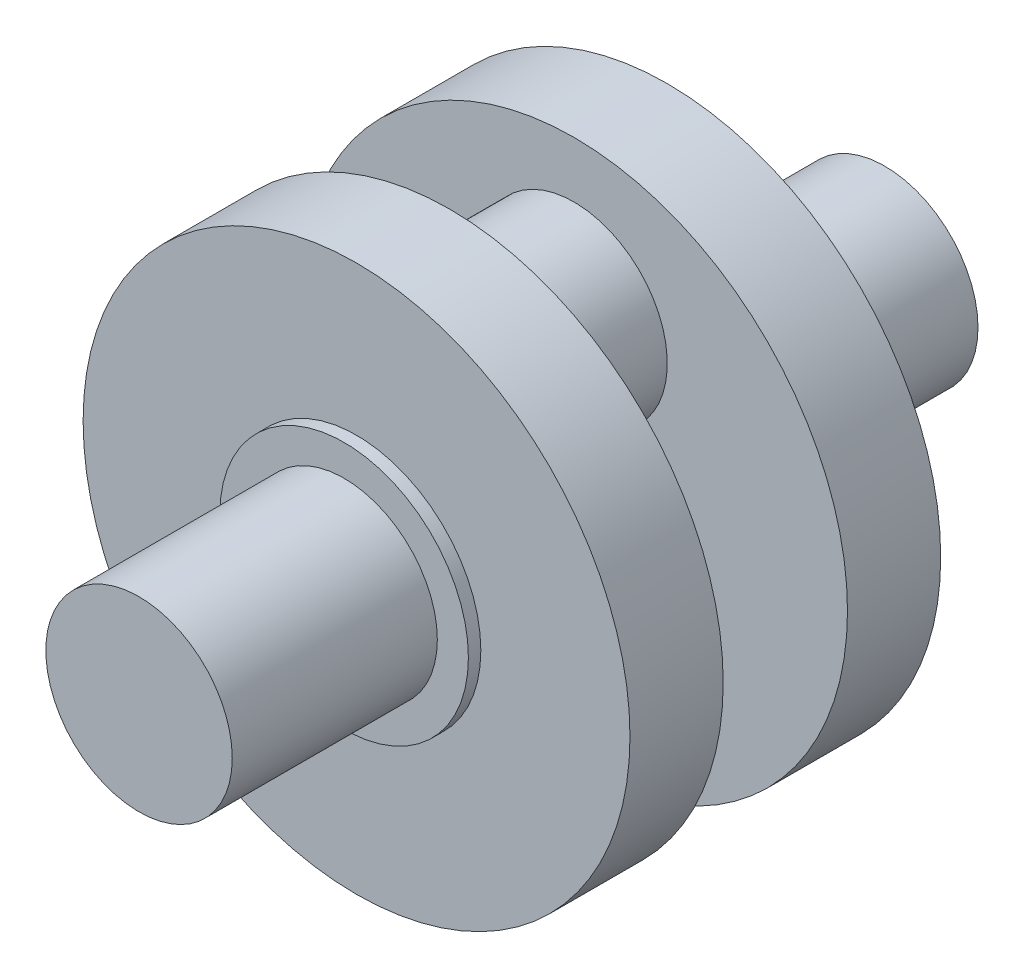
ISO-10303-21;
HEADER;
FILE_DESCRIPTION(('STEP AP214'),'2;1');
FILE_NAME('part.step','',(''),(''),'','','');
FILE_SCHEMA(('AUTOMOTIVE_DESIGN { 1 0 10303 214 1 1 1 1 }'));
ENDSEC;
DATA;
#1=APPLICATION_CONTEXT('core data for automotive mechanical design processes');
#2=APPLICATION_PROTOCOL_DEFINITION('international standard','automotive_design',2000,#1);
#3=PRODUCT_CONTEXT('',#1,'mechanical');
#4=PRODUCT('Part','Part','',(#3));
#5=PRODUCT_RELATED_PRODUCT_CATEGORY('part','',(#4));
#6=PRODUCT_DEFINITION_FORMATION('','',#4);
#7=PRODUCT_DEFINITION_CONTEXT('part definition',#1,'design');
#8=PRODUCT_DEFINITION('design','',#6,#7);
#9=PRODUCT_DEFINITION_SHAPE('','',#8);
#10=(LENGTH_UNIT() NAMED_UNIT(*) SI_UNIT(.MILLI.,.METRE.));
#11=(NAMED_UNIT(*) PLANE_ANGLE_UNIT() SI_UNIT($,.RADIAN.));
#12=(NAMED_UNIT(*) SI_UNIT($,.STERADIAN.) SOLID_ANGLE_UNIT());
#13=UNCERTAINTY_MEASURE_WITH_UNIT(LENGTH_MEASURE(1.E-05),#10,'distance_accuracy_value','');
#14=(GEOMETRIC_REPRESENTATION_CONTEXT(3) GLOBAL_UNCERTAINTY_ASSIGNED_CONTEXT((#13)) GLOBAL_UNIT_ASSIGNED_CONTEXT((#10,
#11,#12)) REPRESENTATION_CONTEXT('',''));
#15=CARTESIAN_POINT('',(0.,0.,0.));
#16=DIRECTION('',(0.,0.,1.));
#17=DIRECTION('',(1.,0.,0.));
#18=AXIS2_PLACEMENT_3D('',#15,#16,#17);
#19=CARTESIAN_POINT('',(0.,0.,33.));
#20=DIRECTION('',(0.,0.,-1.));
#21=DIRECTION('',(-1.,0.,0.));
#22=AXIS2_PLACEMENT_3D('',#19,#20,#21);
#23=CYLINDRICAL_SURFACE('',#22,15.);
#24=CARTESIAN_POINT('',(0.,0.,33.));
#25=DIRECTION('',(0.,0.,1.));
#26=DIRECTION('',(1.,0.,0.));
#27=AXIS2_PLACEMENT_3D('',#24,#25,#26);
#28=CIRCLE('',#27,15.);
#29=CARTESIAN_POINT('',(15.,0.,33.));
#30=VERTEX_POINT('',#29);
#31=EDGE_CURVE('E10',#30,#30,#28,.T.);
#32=ORIENTED_EDGE('',*,*,#31,.F.);
#33=EDGE_LOOP('',(#32));
#34=FACE_BOUND('',#33,.T.);
#35=CARTESIAN_POINT('',(0.,0.,0.));
#36=DIRECTION('',(0.,0.,1.));
#37=DIRECTION('',(1.,0.,0.));
#38=AXIS2_PLACEMENT_3D('',#35,#36,#37);
#39=CIRCLE('',#38,15.);
#40=CARTESIAN_POINT('',(15.,0.,0.));
#41=VERTEX_POINT('',#40);
#42=EDGE_CURVE('E44',#41,#41,#39,.T.);
#43=ORIENTED_EDGE('',*,*,#42,.T.);
#44=EDGE_LOOP('',(#43));
#45=FACE_BOUND('',#44,.T.);
#46=ADVANCED_FACE('F41',(#34,#45),#23,.T.);
#47=CARTESIAN_POINT('',(0.,0.,33.));
#48=DIRECTION('',(0.,0.,1.));
#49=DIRECTION('',(1.,0.,0.));
#50=AXIS2_PLACEMENT_3D('',#47,#48,#49);
#51=PLANE('',#50);
#52=ORIENTED_EDGE('',*,*,#31,.T.);
#53=EDGE_LOOP('',(#52));
#54=FACE_BOUND('',#53,.T.);
#55=ADVANCED_FACE('F124',(#54),#51,.T.);
#56=CARTESIAN_POINT('',(0.,0.,-2.));
#57=DIRECTION('',(0.,0.,1.));
#58=DIRECTION('',(1.,0.,0.));
#59=AXIS2_PLACEMENT_3D('',#56,#57,#58);
#60=CYLINDRICAL_SURFACE('',#59,20.);
#61=CARTESIAN_POINT('',(0.,0.,-2.));
#62=DIRECTION('',(0.,0.,-1.));
#63=DIRECTION('',(-1.,0.,0.));
#64=AXIS2_PLACEMENT_3D('',#61,#62,#63);
#65=CIRCLE('',#64,20.);
#66=CARTESIAN_POINT('',(-20.,0.,-2.));
#67=VERTEX_POINT('',#66);
#68=EDGE_CURVE('E53',#67,#67,#65,.T.);
#69=ORIENTED_EDGE('',*,*,#68,.F.);
#70=EDGE_LOOP('',(#69));
#71=FACE_BOUND('',#70,.T.);
#72=CARTESIAN_POINT('',(0.,0.,0.));
#73=DIRECTION('',(0.,0.,-1.));
#74=DIRECTION('',(-1.,0.,0.));
#75=AXIS2_PLACEMENT_3D('',#72,#73,#74);
#76=CIRCLE('',#75,20.);
#77=CARTESIAN_POINT('',(-20.,0.,0.));
#78=VERTEX_POINT('',#77);
#79=EDGE_CURVE('E55',#78,#78,#76,.T.);
#80=ORIENTED_EDGE('',*,*,#79,.T.);
#81=EDGE_LOOP('',(#80));
#82=FACE_BOUND('',#81,.T.);
#83=ADVANCED_FACE('F129',(#71,#82),#60,.T.);
#84=CARTESIAN_POINT('',(0.,0.,0.));
#85=DIRECTION('',(0.,0.,-1.));
#86=DIRECTION('',(-1.,0.,0.));
#87=AXIS2_PLACEMENT_3D('',#84,#85,#86);
#88=PLANE('',#87);
#89=ORIENTED_EDGE('',*,*,#42,.F.);
#90=EDGE_LOOP('',(#89));
#91=FACE_BOUND('',#90,.T.);
#92=ORIENTED_EDGE('',*,*,#79,.F.);
#93=EDGE_LOOP('',(#92));
#94=FACE_BOUND('',#93,.T.);
#95=ADVANCED_FACE('F133',(#91,#94),#88,.F.);
#96=CARTESIAN_POINT('',(0.,0.,-17.));
#97=DIRECTION('',(0.,0.,1.));
#98=DIRECTION('',(1.,0.,0.));
#99=AXIS2_PLACEMENT_3D('',#96,#97,#98);
#100=CYLINDRICAL_SURFACE('',#99,44.);
#101=CARTESIAN_POINT('',(0.,0.,-17.));
#102=DIRECTION('',(0.,0.,-1.));
#103=DIRECTION('',(-1.,0.,0.));
#104=AXIS2_PLACEMENT_3D('',#101,#102,#103);
#105=CIRCLE('',#104,44.);
#106=CARTESIAN_POINT('',(-44.,0.,-17.));
#107=VERTEX_POINT('',#106);
#108=EDGE_CURVE('E59',#107,#107,#105,.T.);
#109=ORIENTED_EDGE('',*,*,#108,.F.);
#110=EDGE_LOOP('',(#109));
#111=FACE_BOUND('',#110,.T.);
#112=CARTESIAN_POINT('',(0.,0.,-2.));
#113=DIRECTION('',(0.,0.,-1.));
#114=DIRECTION('',(-1.,0.,0.));
#115=AXIS2_PLACEMENT_3D('',#112,#113,#114);
#116=CIRCLE('',#115,44.);
#117=CARTESIAN_POINT('',(-44.,0.,-2.));
#118=VERTEX_POINT('',#117);
#119=EDGE_CURVE('E63',#118,#118,#116,.T.);
#120=ORIENTED_EDGE('',*,*,#119,.T.);
#121=EDGE_LOOP('',(#120));
#122=FACE_BOUND('',#121,.T.);
#123=ADVANCED_FACE('F136',(#111,#122),#100,.T.);
#124=CARTESIAN_POINT('',(0.,0.,-17.));
#125=DIRECTION('',(0.,0.,-1.));
#126=DIRECTION('',(-1.,0.,0.));
#127=AXIS2_PLACEMENT_3D('',#124,#125,#126);
#128=PLANE('',#127);
#129=CARTESIAN_POINT('',(0.,20.,-17.));
#130=DIRECTION('',(0.,0.,-1.));
#131=DIRECTION('',(-1.,0.,0.));
#132=AXIS2_PLACEMENT_3D('',#129,#130,#131);
#133=CIRCLE('',#132,15.);
#134=CARTESIAN_POINT('',(-15.,20.,-17.));
#135=VERTEX_POINT('',#134);
#136=EDGE_CURVE('E67',#135,#135,#133,.T.);
#137=ORIENTED_EDGE('',*,*,#136,.F.);
#138=EDGE_LOOP('',(#137));
#139=FACE_BOUND('',#138,.T.);
#140=ORIENTED_EDGE('',*,*,#108,.T.);
#141=EDGE_LOOP('',(#140));
#142=FACE_BOUND('',#141,.T.);
#143=ADVANCED_FACE('F119',(#139,#142),#128,.T.);
#144=CARTESIAN_POINT('',(0.,0.,-2.));
#145=DIRECTION('',(0.,0.,-1.));
#146=DIRECTION('',(-1.,0.,0.));
#147=AXIS2_PLACEMENT_3D('',#144,#145,#146);
#148=PLANE('',#147);
#149=ORIENTED_EDGE('',*,*,#68,.T.);
#150=EDGE_LOOP('',(#149));
#151=FACE_BOUND('',#150,.T.);
#152=ORIENTED_EDGE('',*,*,#119,.F.);
#153=EDGE_LOOP('',(#152));
#154=FACE_BOUND('',#153,.T.);
#155=ADVANCED_FACE('F109',(#151,#154),#148,.F.);
#156=CARTESIAN_POINT('',(0.,20.,-27.));
#157=DIRECTION('',(0.,0.,1.));
#158=DIRECTION('',(1.,0.,0.));
#159=AXIS2_PLACEMENT_3D('',#156,#157,#158);
#160=CYLINDRICAL_SURFACE('',#159,15.);
#161=ORIENTED_EDGE('',*,*,#136,.T.);
#162=EDGE_LOOP('',(#161));
#163=FACE_BOUND('',#162,.T.);
#164=CARTESIAN_POINT('',(0.,20.,-37.));
#165=DIRECTION('',(0.,0.,-1.));
#166=DIRECTION('',(-1.,0.,0.));
#167=AXIS2_PLACEMENT_3D('',#164,#165,#166);
#168=CIRCLE('',#167,15.);
#169=CARTESIAN_POINT('',(-15.,20.,-37.));
#170=VERTEX_POINT('',#169);
#171=EDGE_CURVE('E95',#170,#170,#168,.T.);
#172=ORIENTED_EDGE('',*,*,#171,.F.);
#173=EDGE_LOOP('',(#172));
#174=FACE_BOUND('',#173,.T.);
#175=ADVANCED_FACE('F106',(#163,#174),#160,.T.);
#176=CARTESIAN_POINT('',(0.,0.,-87.));
#177=DIRECTION('',(0.,0.,1.));
#178=DIRECTION('',(-1.,0.,0.));
#179=AXIS2_PLACEMENT_3D('',#176,#177,#178);
#180=CYLINDRICAL_SURFACE('',#179,15.);
#181=CARTESIAN_POINT('',(0.,0.,-87.));
#182=DIRECTION('',(0.,0.,1.));
#183=DIRECTION('',(1.,0.,0.));
#184=AXIS2_PLACEMENT_3D('',#181,#182,#183);
#185=CIRCLE('',#184,15.);
#186=CARTESIAN_POINT('',(15.,0.,-87.));
#187=VERTEX_POINT('',#186);
#188=EDGE_CURVE('E74',#187,#187,#185,.T.);
#189=ORIENTED_EDGE('',*,*,#188,.T.);
#190=EDGE_LOOP('',(#189));
#191=FACE_BOUND('',#190,.T.);
#192=CARTESIAN_POINT('',(0.,0.,-54.));
#193=DIRECTION('',(0.,0.,1.));
#194=DIRECTION('',(1.,0.,0.));
#195=AXIS2_PLACEMENT_3D('',#192,#193,#194);
#196=CIRCLE('',#195,15.);
#197=CARTESIAN_POINT('',(15.,0.,-54.));
#198=VERTEX_POINT('',#197);
#199=EDGE_CURVE('E75',#198,#198,#196,.T.);
#200=ORIENTED_EDGE('',*,*,#199,.F.);
#201=EDGE_LOOP('',(#200));
#202=FACE_BOUND('',#201,.T.);
#203=ADVANCED_FACE('F108',(#191,#202),#180,.T.);
#204=CARTESIAN_POINT('',(0.,0.,-87.));
#205=DIRECTION('',(0.,0.,-1.));
#206=DIRECTION('',(1.,0.,0.));
#207=AXIS2_PLACEMENT_3D('',#204,#205,#206);
#208=PLANE('',#207);
#209=ORIENTED_EDGE('',*,*,#188,.F.);
#210=EDGE_LOOP('',(#209));
#211=FACE_BOUND('',#210,.T.);
#212=ADVANCED_FACE('F116',(#211),#208,.T.);
#213=CARTESIAN_POINT('',(0.,0.,-52.));
#214=DIRECTION('',(0.,0.,-1.));
#215=DIRECTION('',(1.,0.,0.));
#216=AXIS2_PLACEMENT_3D('',#213,#214,#215);
#217=CYLINDRICAL_SURFACE('',#216,20.);
#218=CARTESIAN_POINT('',(0.,0.,-52.));
#219=DIRECTION('',(0.,0.,-1.));
#220=DIRECTION('',(-1.,0.,0.));
#221=AXIS2_PLACEMENT_3D('',#218,#219,#220);
#222=CIRCLE('',#221,20.);
#223=CARTESIAN_POINT('',(-20.,0.,-52.));
#224=VERTEX_POINT('',#223);
#225=EDGE_CURVE('E79',#224,#224,#222,.T.);
#226=ORIENTED_EDGE('',*,*,#225,.T.);
#227=EDGE_LOOP('',(#226));
#228=FACE_BOUND('',#227,.T.);
#229=CARTESIAN_POINT('',(0.,0.,-54.));
#230=DIRECTION('',(0.,0.,-1.));
#231=DIRECTION('',(-1.,0.,0.));
#232=AXIS2_PLACEMENT_3D('',#229,#230,#231);
#233=CIRCLE('',#232,20.);
#234=CARTESIAN_POINT('',(-20.,0.,-54.));
#235=VERTEX_POINT('',#234);
#236=EDGE_CURVE('E83',#235,#235,#233,.T.);
#237=ORIENTED_EDGE('',*,*,#236,.F.);
#238=EDGE_LOOP('',(#237));
#239=FACE_BOUND('',#238,.T.);
#240=ADVANCED_FACE('F225',(#228,#239),#217,.T.);
#241=CARTESIAN_POINT('',(0.,0.,-54.));
#242=DIRECTION('',(0.,0.,1.));
#243=DIRECTION('',(-1.,0.,0.));
#244=AXIS2_PLACEMENT_3D('',#241,#242,#243);
#245=PLANE('',#244);
#246=ORIENTED_EDGE('',*,*,#199,.T.);
#247=EDGE_LOOP('',(#246));
#248=FACE_BOUND('',#247,.T.);
#249=ORIENTED_EDGE('',*,*,#236,.T.);
#250=EDGE_LOOP('',(#249));
#251=FACE_BOUND('',#250,.T.);
#252=ADVANCED_FACE('F235',(#248,#251),#245,.F.);
#253=CARTESIAN_POINT('',(0.,0.,-37.));
#254=DIRECTION('',(0.,0.,-1.));
#255=DIRECTION('',(1.,0.,0.));
#256=AXIS2_PLACEMENT_3D('',#253,#254,#255);
#257=CYLINDRICAL_SURFACE('',#256,44.);
#258=CARTESIAN_POINT('',(0.,0.,-37.));
#259=DIRECTION('',(0.,0.,-1.));
#260=DIRECTION('',(-1.,0.,0.));
#261=AXIS2_PLACEMENT_3D('',#258,#259,#260);
#262=CIRCLE('',#261,44.);
#263=CARTESIAN_POINT('',(-44.,0.,-37.));
#264=VERTEX_POINT('',#263);
#265=EDGE_CURVE('E87',#264,#264,#262,.T.);
#266=ORIENTED_EDGE('',*,*,#265,.T.);
#267=EDGE_LOOP('',(#266));
#268=FACE_BOUND('',#267,.T.);
#269=CARTESIAN_POINT('',(0.,0.,-52.));
#270=DIRECTION('',(0.,0.,-1.));
#271=DIRECTION('',(-1.,0.,0.));
#272=AXIS2_PLACEMENT_3D('',#269,#270,#271);
#273=CIRCLE('',#272,44.);
#274=CARTESIAN_POINT('',(-44.,0.,-52.));
#275=VERTEX_POINT('',#274);
#276=EDGE_CURVE('E91',#275,#275,#273,.T.);
#277=ORIENTED_EDGE('',*,*,#276,.F.);
#278=EDGE_LOOP('',(#277));
#279=FACE_BOUND('',#278,.T.);
#280=ADVANCED_FACE('F245',(#268,#279),#257,.T.);
#281=CARTESIAN_POINT('',(0.,0.,-37.));
#282=DIRECTION('',(0.,0.,1.));
#283=DIRECTION('',(-1.,0.,0.));
#284=AXIS2_PLACEMENT_3D('',#281,#282,#283);
#285=PLANE('',#284);
#286=ORIENTED_EDGE('',*,*,#171,.T.);
#287=EDGE_LOOP('',(#286));
#288=FACE_BOUND('',#287,.T.);
#289=ORIENTED_EDGE('',*,*,#265,.F.);
#290=EDGE_LOOP('',(#289));
#291=FACE_BOUND('',#290,.T.);
#292=ADVANCED_FACE('F103',(#288,#291),#285,.T.);
#293=CARTESIAN_POINT('',(0.,0.,-52.));
#294=DIRECTION('',(0.,0.,1.));
#295=DIRECTION('',(-1.,0.,0.));
#296=AXIS2_PLACEMENT_3D('',#293,#294,#295);
#297=PLANE('',#296);
#298=ORIENTED_EDGE('',*,*,#225,.F.);
#299=EDGE_LOOP('',(#298));
#300=FACE_BOUND('',#299,.T.);
#301=ORIENTED_EDGE('',*,*,#276,.T.);
#302=EDGE_LOOP('',(#301));
#303=FACE_BOUND('',#302,.T.);
#304=ADVANCED_FACE('F264',(#300,#303),#297,.F.);
#305=CLOSED_SHELL('',(#46,#55,#83,#95,#123,#143,#155,#175,#203,#212,#240,#252,#280,#292,#304));
#306=MANIFOLD_SOLID_BREP('B2',#305);
#307=ADVANCED_BREP_SHAPE_REPRESENTATION('',(#18,#306),#14);
#308=SHAPE_DEFINITION_REPRESENTATION(#9,#307);
ENDSEC;
END-ISO-10303-21;
